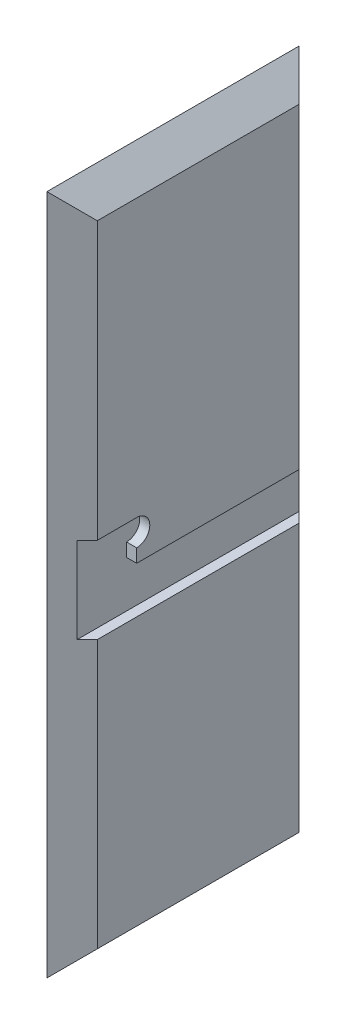
ISO-10303-21;
HEADER;
FILE_DESCRIPTION(('STEP AP214'),'2;1');
FILE_NAME('part.step','',(''),(''),'','','');
FILE_SCHEMA(('AUTOMOTIVE_DESIGN { 1 0 10303 214 1 1 1 1 }'));
ENDSEC;
DATA;
#1=APPLICATION_CONTEXT('core data for automotive mechanical design processes');
#2=APPLICATION_PROTOCOL_DEFINITION('international standard','automotive_design',2000,#1);
#3=PRODUCT_CONTEXT('',#1,'mechanical');
#4=PRODUCT('Part','Part','',(#3));
#5=PRODUCT_RELATED_PRODUCT_CATEGORY('part','',(#4));
#6=PRODUCT_DEFINITION_FORMATION('','',#4);
#7=PRODUCT_DEFINITION_CONTEXT('part definition',#1,'design');
#8=PRODUCT_DEFINITION('design','',#6,#7);
#9=PRODUCT_DEFINITION_SHAPE('','',#8);
#10=(LENGTH_UNIT() NAMED_UNIT(*) SI_UNIT(.MILLI.,.METRE.));
#11=(NAMED_UNIT(*) PLANE_ANGLE_UNIT() SI_UNIT($,.RADIAN.));
#12=(NAMED_UNIT(*) SI_UNIT($,.STERADIAN.) SOLID_ANGLE_UNIT());
#13=UNCERTAINTY_MEASURE_WITH_UNIT(LENGTH_MEASURE(1.E-05),#10,'distance_accuracy_value','');
#14=(GEOMETRIC_REPRESENTATION_CONTEXT(3) GLOBAL_UNCERTAINTY_ASSIGNED_CONTEXT((#13)) GLOBAL_UNIT_ASSIGNED_CONTEXT((#10,
#11,#12)) REPRESENTATION_CONTEXT('',''));
#15=CARTESIAN_POINT('',(0.,0.,0.));
#16=DIRECTION('',(0.,0.,1.));
#17=DIRECTION('',(1.,0.,0.));
#18=AXIS2_PLACEMENT_3D('',#15,#16,#17);
#19=CARTESIAN_POINT('',(0.,171.45,63.4999999999994));
#20=DIRECTION('',(0.707106781186549,0.,0.707106781186546));
#21=DIRECTION('',(0.707106781186546,0.,-0.707106781186549));
#22=AXIS2_PLACEMENT_3D('',#19,#20,#21);
#23=PLANE('',#22);
#24=DIRECTION('',(-0.707106781186546,0.,0.707106781186549));
#25=VECTOR('',#24,1.);
#26=CARTESIAN_POINT('',(0.,-23.876,63.4999999999994));
#27=LINE('',#26,#25);
#28=CARTESIAN_POINT('',(7.62,-23.876,55.8799999999994));
#29=VERTEX_POINT('',#28);
#30=CARTESIAN_POINT('',(12.7,-23.876,50.7999999999994));
#31=VERTEX_POINT('',#30);
#32=EDGE_CURVE('E167',#29,#31,#27,.F.);
#33=ORIENTED_EDGE('',*,*,#32,.F.);
#34=DIRECTION('',(0.,-1.,0.));
#35=VECTOR('',#34,1.);
#36=CARTESIAN_POINT('',(7.62,171.45,55.8799999999994));
#37=LINE('',#36,#35);
#38=CARTESIAN_POINT('',(7.62,19.431,55.8799999999994));
#39=VERTEX_POINT('',#38);
#40=EDGE_CURVE('E199',#29,#39,#37,.F.);
#41=ORIENTED_EDGE('',*,*,#40,.T.);
#42=DIRECTION('',(0.707106781186546,0.,-0.707106781186549));
#43=VECTOR('',#42,1.);
#44=CARTESIAN_POINT('',(0.,19.431,63.4999999999994));
#45=LINE('',#44,#43);
#46=CARTESIAN_POINT('',(12.7,19.431,50.7999999999994));
#47=VERTEX_POINT('',#46);
#48=EDGE_CURVE('E198',#47,#39,#45,.F.);
#49=ORIENTED_EDGE('',*,*,#48,.F.);
#50=DIRECTION('',(0.,1.,0.));
#51=VECTOR('',#50,1.);
#52=CARTESIAN_POINT('',(12.7,171.45,50.7999999999994));
#53=LINE('',#52,#51);
#54=CARTESIAN_POINT('',(12.7,158.75,50.7999999999994));
#55=VERTEX_POINT('',#54);
#56=EDGE_CURVE('E142',#55,#47,#53,.F.);
#57=ORIENTED_EDGE('',*,*,#56,.F.);
#58=DIRECTION('',(-0.577350269189624,0.577350269189627,0.577350269189627));
#59=VECTOR('',#58,1.);
#60=CARTESIAN_POINT('',(0.,171.45,63.4999999999994));
#61=LINE('',#60,#59);
#62=CARTESIAN_POINT('',(0.,171.45,63.4999999999994));
#63=VERTEX_POINT('',#62);
#64=EDGE_CURVE('E189',#55,#63,#61,.T.);
#65=ORIENTED_EDGE('',*,*,#64,.T.);
#66=DIRECTION('',(0.,-1.,0.));
#67=VECTOR('',#66,1.);
#68=CARTESIAN_POINT('',(0.,171.45,63.4999999999994));
#69=LINE('',#68,#67);
#70=CARTESIAN_POINT('',(0.,-171.45,63.4999999999994));
#71=VERTEX_POINT('',#70);
#72=EDGE_CURVE('E209',#63,#71,#69,.T.);
#73=ORIENTED_EDGE('',*,*,#72,.T.);
#74=DIRECTION('',(-0.577350269189624,-0.577350269189627,0.577350269189626));
#75=VECTOR('',#74,1.);
#76=CARTESIAN_POINT('',(0.,-171.45,63.4999999999994));
#77=LINE('',#76,#75);
#78=CARTESIAN_POINT('',(12.7,-158.75,50.7999999999994));
#79=VERTEX_POINT('',#78);
#80=EDGE_CURVE('E138',#79,#71,#77,.T.);
#81=ORIENTED_EDGE('',*,*,#80,.F.);
#82=EDGE_CURVE('E157',#31,#79,#53,.F.);
#83=ORIENTED_EDGE('',*,*,#82,.F.);
#84=EDGE_LOOP('',(#33,#41,#49,#57,#65,#73,#81,#83));
#85=FACE_BOUND('',#84,.T.);
#86=ADVANCED_FACE('F39',(#85),#23,.T.);
#87=CARTESIAN_POINT('',(0.,171.45,-63.4999999999995));
#88=DIRECTION('',(0.707106781186549,0.,-0.707106781186546));
#89=DIRECTION('',(-0.707106781186546,0.,-0.707106781186549));
#90=AXIS2_PLACEMENT_3D('',#87,#88,#89);
#91=PLANE('',#90);
#92=DIRECTION('',(0.707106781186546,0.,0.707106781186549));
#93=VECTOR('',#92,1.);
#94=CARTESIAN_POINT('',(0.,-23.876,-63.4999999999995));
#95=LINE('',#94,#93);
#96=CARTESIAN_POINT('',(12.7,-23.876,-50.7999999999995));
#97=VERTEX_POINT('',#96);
#98=CARTESIAN_POINT('',(7.62,-23.876,-55.8799999999995));
#99=VERTEX_POINT('',#98);
#100=EDGE_CURVE('E202',#97,#99,#95,.F.);
#101=ORIENTED_EDGE('',*,*,#100,.F.);
#102=DIRECTION('',(0.,-1.,0.));
#103=VECTOR('',#102,1.);
#104=CARTESIAN_POINT('',(12.7,171.45,-50.7999999999995));
#105=LINE('',#104,#103);
#106=CARTESIAN_POINT('',(12.7,-158.75,-50.7999999999995));
#107=VERTEX_POINT('',#106);
#108=EDGE_CURVE('E160',#107,#97,#105,.F.);
#109=ORIENTED_EDGE('',*,*,#108,.F.);
#110=DIRECTION('',(-0.577350269189624,-0.577350269189627,-0.577350269189627));
#111=VECTOR('',#110,1.);
#112=CARTESIAN_POINT('',(114.3,-57.1499999999998,50.8000000000009));
#113=LINE('',#112,#111);
#114=CARTESIAN_POINT('',(0.,-171.45,-63.4999999999996));
#115=VERTEX_POINT('',#114);
#116=EDGE_CURVE('E183',#107,#115,#113,.T.);
#117=ORIENTED_EDGE('',*,*,#116,.T.);
#118=DIRECTION('',(0.,1.,0.));
#119=VECTOR('',#118,1.);
#120=CARTESIAN_POINT('',(0.,171.45,-63.4999999999995));
#121=LINE('',#120,#119);
#122=CARTESIAN_POINT('',(0.,171.45,-63.4999999999995));
#123=VERTEX_POINT('',#122);
#124=EDGE_CURVE('E172',#115,#123,#121,.T.);
#125=ORIENTED_EDGE('',*,*,#124,.T.);
#126=DIRECTION('',(-0.577350269189624,0.577350269189627,-0.577350269189626));
#127=VECTOR('',#126,1.);
#128=CARTESIAN_POINT('',(42.3333333333329,129.116666666667,-21.1666666666665));
#129=LINE('',#128,#127);
#130=CARTESIAN_POINT('',(12.7,158.75,-50.7999999999995));
#131=VERTEX_POINT('',#130);
#132=EDGE_CURVE('E186',#131,#123,#129,.T.);
#133=ORIENTED_EDGE('',*,*,#132,.F.);
#134=CARTESIAN_POINT('',(12.7,-0.508000000000002,-50.7999999999995));
#135=VERTEX_POINT('',#134);
#136=EDGE_CURVE('E193',#135,#131,#105,.F.);
#137=ORIENTED_EDGE('',*,*,#136,.F.);
#138=DIRECTION('',(-0.707106781186546,0.,-0.707106781186549));
#139=VECTOR('',#138,1.);
#140=CARTESIAN_POINT('',(0.,-0.508000000000008,-63.4999999999996));
#141=LINE('',#140,#139);
#142=CARTESIAN_POINT('',(7.62,-0.508000000000001,-55.8799999999995));
#143=VERTEX_POINT('',#142);
#144=EDGE_CURVE('E200',#143,#135,#141,.F.);
#145=ORIENTED_EDGE('',*,*,#144,.F.);
#146=DIRECTION('',(0.,1.,0.));
#147=VECTOR('',#146,1.);
#148=CARTESIAN_POINT('',(7.62,171.45,-55.8799999999995));
#149=LINE('',#148,#147);
#150=EDGE_CURVE('E11',#143,#99,#149,.F.);
#151=ORIENTED_EDGE('',*,*,#150,.T.);
#152=EDGE_LOOP('',(#101,#109,#117,#125,#133,#137,#145,#151));
#153=FACE_BOUND('',#152,.T.);
#154=ADVANCED_FACE('F216',(#153),#91,.T.);
#155=CARTESIAN_POINT('',(12.7,0.,0.));
#156=DIRECTION('',(1.,0.,0.));
#157=DIRECTION('',(0.,0.,-1.));
#158=AXIS2_PLACEMENT_3D('',#155,#156,#157);
#159=PLANE('',#158);
#160=ORIENTED_EDGE('',*,*,#108,.T.);
#161=DIRECTION('',(0.,0.,1.));
#162=VECTOR('',#161,1.);
#163=CARTESIAN_POINT('',(12.7,-23.876,0.));
#164=LINE('',#163,#162);
#165=EDGE_CURVE('E49',#97,#31,#164,.T.);
#166=ORIENTED_EDGE('',*,*,#165,.T.);
#167=ORIENTED_EDGE('',*,*,#82,.T.);
#168=DIRECTION('',(0.,0.,1.));
#169=VECTOR('',#168,1.);
#170=CARTESIAN_POINT('',(12.7,-158.75,63.4999999999994));
#171=LINE('',#170,#169);
#172=EDGE_CURVE('E171',#79,#107,#171,.F.);
#173=ORIENTED_EDGE('',*,*,#172,.T.);
#174=EDGE_LOOP('',(#160,#166,#167,#173));
#175=FACE_BOUND('',#174,.T.);
#176=ADVANCED_FACE('F156',(#175),#159,.T.);
#177=DIRECTION('',(0.,-1.,0.));
#178=VECTOR('',#177,1.);
#179=CARTESIAN_POINT('',(12.7,0.,30.9879999999996));
#180=LINE('',#179,#178);
#181=CARTESIAN_POINT('',(12.7,6.22300000000001,30.9879999999996));
#182=VERTEX_POINT('',#181);
#183=CARTESIAN_POINT('',(12.7,-0.508000000000012,30.9879999999996));
#184=VERTEX_POINT('',#183);
#185=EDGE_CURVE('E143',#182,#184,#180,.T.);
#186=ORIENTED_EDGE('',*,*,#185,.T.);
#187=DIRECTION('',(0.,0.,-1.));
#188=VECTOR('',#187,1.);
#189=CARTESIAN_POINT('',(12.7,-0.508000000000008,0.));
#190=LINE('',#189,#188);
#191=EDGE_CURVE('E145',#184,#135,#190,.T.);
#192=ORIENTED_EDGE('',*,*,#191,.T.);
#193=ORIENTED_EDGE('',*,*,#136,.T.);
#194=DIRECTION('',(0.,0.,-1.));
#195=VECTOR('',#194,1.);
#196=CARTESIAN_POINT('',(12.7,158.75,63.4999999999994));
#197=LINE('',#196,#195);
#198=EDGE_CURVE('E191',#131,#55,#197,.F.);
#199=ORIENTED_EDGE('',*,*,#198,.T.);
#200=ORIENTED_EDGE('',*,*,#56,.T.);
#201=DIRECTION('',(0.,0.,-1.));
#202=VECTOR('',#201,1.);
#203=CARTESIAN_POINT('',(12.7,19.431,0.));
#204=LINE('',#203,#202);
#205=CARTESIAN_POINT('',(12.7,19.431,30.9879999999996));
#206=VERTEX_POINT('',#205);
#207=EDGE_CURVE('E127',#47,#206,#204,.T.);
#208=ORIENTED_EDGE('',*,*,#207,.T.);
#209=CARTESIAN_POINT('',(12.7,12.827,30.9879999999996));
#210=DIRECTION('',(1.,0.,0.));
#211=DIRECTION('',(0.,0.,-1.));
#212=AXIS2_PLACEMENT_3D('',#209,#210,#211);
#213=CIRCLE('',#212,6.604);
#214=EDGE_CURVE('E43',#182,#206,#213,.T.);
#215=ORIENTED_EDGE('',*,*,#214,.F.);
#216=EDGE_LOOP('',(#186,#192,#193,#199,#200,#208,#215));
#217=FACE_BOUND('',#216,.T.);
#218=ADVANCED_FACE('F140',(#217),#159,.T.);
#219=CARTESIAN_POINT('',(0.,-171.45,63.4999999999994));
#220=DIRECTION('',(0.707106781186549,-0.707106781186546,0.));
#221=DIRECTION('',(0.707106781186546,0.707106781186549,0.));
#222=AXIS2_PLACEMENT_3D('',#219,#220,#221);
#223=PLANE('',#222);
#224=DIRECTION('',(0.,0.,-1.));
#225=VECTOR('',#224,1.);
#226=CARTESIAN_POINT('',(0.,-171.45,63.4999999999994));
#227=LINE('',#226,#225);
#228=EDGE_CURVE('E179',#71,#115,#227,.T.);
#229=ORIENTED_EDGE('',*,*,#228,.T.);
#230=ORIENTED_EDGE('',*,*,#116,.F.);
#231=ORIENTED_EDGE('',*,*,#172,.F.);
#232=ORIENTED_EDGE('',*,*,#80,.T.);
#233=EDGE_LOOP('',(#229,#230,#231,#232));
#234=FACE_BOUND('',#233,.T.);
#235=ADVANCED_FACE('F212',(#234),#223,.T.);
#236=CARTESIAN_POINT('',(0.,171.45,63.4999999999994));
#237=DIRECTION('',(0.707106781186549,0.707106781186546,0.));
#238=DIRECTION('',(-0.707106781186546,0.707106781186549,0.));
#239=AXIS2_PLACEMENT_3D('',#236,#237,#238);
#240=PLANE('',#239);
#241=DIRECTION('',(0.,0.,1.));
#242=VECTOR('',#241,1.);
#243=CARTESIAN_POINT('',(0.,171.45,63.4999999999994));
#244=LINE('',#243,#242);
#245=EDGE_CURVE('E170',#123,#63,#244,.T.);
#246=ORIENTED_EDGE('',*,*,#245,.T.);
#247=ORIENTED_EDGE('',*,*,#64,.F.);
#248=ORIENTED_EDGE('',*,*,#198,.F.);
#249=ORIENTED_EDGE('',*,*,#132,.T.);
#250=EDGE_LOOP('',(#246,#247,#248,#249));
#251=FACE_BOUND('',#250,.T.);
#252=ADVANCED_FACE('F41',(#251),#240,.T.);
#253=CARTESIAN_POINT('',(0.,0.,0.));
#254=DIRECTION('',(1.,0.,0.));
#255=DIRECTION('',(0.,0.,-1.));
#256=AXIS2_PLACEMENT_3D('',#253,#254,#255);
#257=PLANE('',#256);
#258=ORIENTED_EDGE('',*,*,#72,.F.);
#259=ORIENTED_EDGE('',*,*,#245,.F.);
#260=ORIENTED_EDGE('',*,*,#124,.F.);
#261=ORIENTED_EDGE('',*,*,#228,.F.);
#262=EDGE_LOOP('',(#258,#259,#260,#261));
#263=FACE_BOUND('',#262,.T.);
#264=ADVANCED_FACE('F217',(#263),#257,.F.);
#265=CARTESIAN_POINT('',(7.62,12.827,30.9879999999996));
#266=DIRECTION('',(-1.,0.,0.));
#267=DIRECTION('',(0.,0.,1.));
#268=AXIS2_PLACEMENT_3D('',#265,#266,#267);
#269=PLANE('',#268);
#270=DIRECTION('',(0.,0.,-1.));
#271=VECTOR('',#270,1.);
#272=CARTESIAN_POINT('',(7.62,-23.876,63.4999999999994));
#273=LINE('',#272,#271);
#274=EDGE_CURVE('E333',#29,#99,#273,.T.);
#275=ORIENTED_EDGE('',*,*,#274,.T.);
#276=ORIENTED_EDGE('',*,*,#150,.F.);
#277=DIRECTION('',(0.,0.,1.));
#278=VECTOR('',#277,1.);
#279=CARTESIAN_POINT('',(7.62,-0.508,-63.4999999999996));
#280=LINE('',#279,#278);
#281=CARTESIAN_POINT('',(7.62,-0.508000000000012,30.9879999999996));
#282=VERTEX_POINT('',#281);
#283=EDGE_CURVE('E119',#143,#282,#280,.T.);
#284=ORIENTED_EDGE('',*,*,#283,.T.);
#285=DIRECTION('',(0.,1.,0.));
#286=VECTOR('',#285,1.);
#287=CARTESIAN_POINT('',(7.62,6.22300000000001,30.9879999999996));
#288=LINE('',#287,#286);
#289=CARTESIAN_POINT('',(7.62,6.22300000000001,30.9879999999996));
#290=VERTEX_POINT('',#289);
#291=EDGE_CURVE('E327',#282,#290,#288,.T.);
#292=ORIENTED_EDGE('',*,*,#291,.T.);
#293=CARTESIAN_POINT('',(7.62,12.827,30.9879999999996));
#294=DIRECTION('',(1.,0.,0.));
#295=DIRECTION('',(0.,0.,1.));
#296=AXIS2_PLACEMENT_3D('',#293,#294,#295);
#297=CIRCLE('',#296,6.604);
#298=CARTESIAN_POINT('',(7.62,19.431,30.9879999999996));
#299=VERTEX_POINT('',#298);
#300=EDGE_CURVE('E329',#290,#299,#297,.T.);
#301=ORIENTED_EDGE('',*,*,#300,.T.);
#302=DIRECTION('',(0.,0.,1.));
#303=VECTOR('',#302,1.);
#304=CARTESIAN_POINT('',(7.62,19.431,63.4999999999994));
#305=LINE('',#304,#303);
#306=EDGE_CURVE('E130',#299,#39,#305,.T.);
#307=ORIENTED_EDGE('',*,*,#306,.T.);
#308=ORIENTED_EDGE('',*,*,#40,.F.);
#309=EDGE_LOOP('',(#275,#276,#284,#292,#301,#307,#308));
#310=FACE_BOUND('',#309,.T.);
#311=ADVANCED_FACE('F219',(#310),#269,.F.);
#312=CARTESIAN_POINT('',(12.700012,-23.876,63.4999999999994));
#313=DIRECTION('',(0.,1.,0.));
#314=DIRECTION('',(0.,0.,1.));
#315=AXIS2_PLACEMENT_3D('',#312,#313,#314);
#316=PLANE('',#315);
#317=ORIENTED_EDGE('',*,*,#32,.T.);
#318=ORIENTED_EDGE('',*,*,#165,.F.);
#319=ORIENTED_EDGE('',*,*,#100,.T.);
#320=ORIENTED_EDGE('',*,*,#274,.F.);
#321=EDGE_LOOP('',(#317,#318,#319,#320));
#322=FACE_BOUND('',#321,.T.);
#323=ADVANCED_FACE('F225',(#322),#316,.T.);
#324=CARTESIAN_POINT('',(12.700012,-0.508,-63.4999999999996));
#325=DIRECTION('',(0.,-1.,0.));
#326=DIRECTION('',(0.,0.,-1.));
#327=AXIS2_PLACEMENT_3D('',#324,#325,#326);
#328=PLANE('',#327);
#329=ORIENTED_EDGE('',*,*,#144,.T.);
#330=ORIENTED_EDGE('',*,*,#191,.F.);
#331=DIRECTION('',(-1.,0.,0.));
#332=VECTOR('',#331,1.);
#333=CARTESIAN_POINT('',(12.700012,-0.508000000000012,30.9879999999996));
#334=LINE('',#333,#332);
#335=EDGE_CURVE('E132',#184,#282,#334,.T.);
#336=ORIENTED_EDGE('',*,*,#335,.T.);
#337=ORIENTED_EDGE('',*,*,#283,.F.);
#338=EDGE_LOOP('',(#329,#330,#336,#337));
#339=FACE_BOUND('',#338,.T.);
#340=ADVANCED_FACE('F244',(#339),#328,.T.);
#341=CARTESIAN_POINT('',(12.700012,19.431,63.4999999999994));
#342=DIRECTION('',(0.,-1.,0.));
#343=DIRECTION('',(0.,0.,-1.));
#344=AXIS2_PLACEMENT_3D('',#341,#342,#343);
#345=PLANE('',#344);
#346=ORIENTED_EDGE('',*,*,#48,.T.);
#347=ORIENTED_EDGE('',*,*,#306,.F.);
#348=DIRECTION('',(1.,0.,0.));
#349=VECTOR('',#348,1.);
#350=CARTESIAN_POINT('',(7.62,19.431,30.9879999999996));
#351=LINE('',#350,#349);
#352=EDGE_CURVE('E124',#299,#206,#351,.T.);
#353=ORIENTED_EDGE('',*,*,#352,.T.);
#354=ORIENTED_EDGE('',*,*,#207,.F.);
#355=EDGE_LOOP('',(#346,#347,#353,#354));
#356=FACE_BOUND('',#355,.T.);
#357=ADVANCED_FACE('F125',(#356),#345,.T.);
#358=CARTESIAN_POINT('',(12.700012,6.22300000000001,30.9879999999996));
#359=DIRECTION('',(0.,0.,1.));
#360=DIRECTION('',(1.,0.,0.));
#361=AXIS2_PLACEMENT_3D('',#358,#359,#360);
#362=PLANE('',#361);
#363=DIRECTION('',(1.,0.,0.));
#364=VECTOR('',#363,1.);
#365=CARTESIAN_POINT('',(7.62,6.22300000000001,30.9879999999996));
#366=LINE('',#365,#364);
#367=EDGE_CURVE('E56',#290,#182,#366,.T.);
#368=ORIENTED_EDGE('',*,*,#367,.F.);
#369=ORIENTED_EDGE('',*,*,#291,.F.);
#370=ORIENTED_EDGE('',*,*,#335,.F.);
#371=ORIENTED_EDGE('',*,*,#185,.F.);
#372=EDGE_LOOP('',(#368,#369,#370,#371));
#373=FACE_BOUND('',#372,.T.);
#374=ADVANCED_FACE('F248',(#373),#362,.T.);
#375=CARTESIAN_POINT('',(7.62,12.827,30.9879999999996));
#376=DIRECTION('',(1.,0.,0.));
#377=DIRECTION('',(0.,0.,-1.));
#378=AXIS2_PLACEMENT_3D('',#375,#376,#377);
#379=CYLINDRICAL_SURFACE('',#378,6.604);
#380=ORIENTED_EDGE('',*,*,#214,.T.);
#381=ORIENTED_EDGE('',*,*,#352,.F.);
#382=ORIENTED_EDGE('',*,*,#300,.F.);
#383=ORIENTED_EDGE('',*,*,#367,.T.);
#384=EDGE_LOOP('',(#380,#381,#382,#383));
#385=FACE_BOUND('',#384,.T.);
#386=ADVANCED_FACE('F135',(#385),#379,.F.);
#387=CLOSED_SHELL('',(#86,#154,#176,#218,#235,#252,#264,#311,#323,#340,#357,#374,#386));
#388=MANIFOLD_SOLID_BREP('B2',#387);
#389=ADVANCED_BREP_SHAPE_REPRESENTATION('',(#18,#388),#14);
#390=SHAPE_DEFINITION_REPRESENTATION(#9,#389);
ENDSEC;
END-ISO-10303-21;
